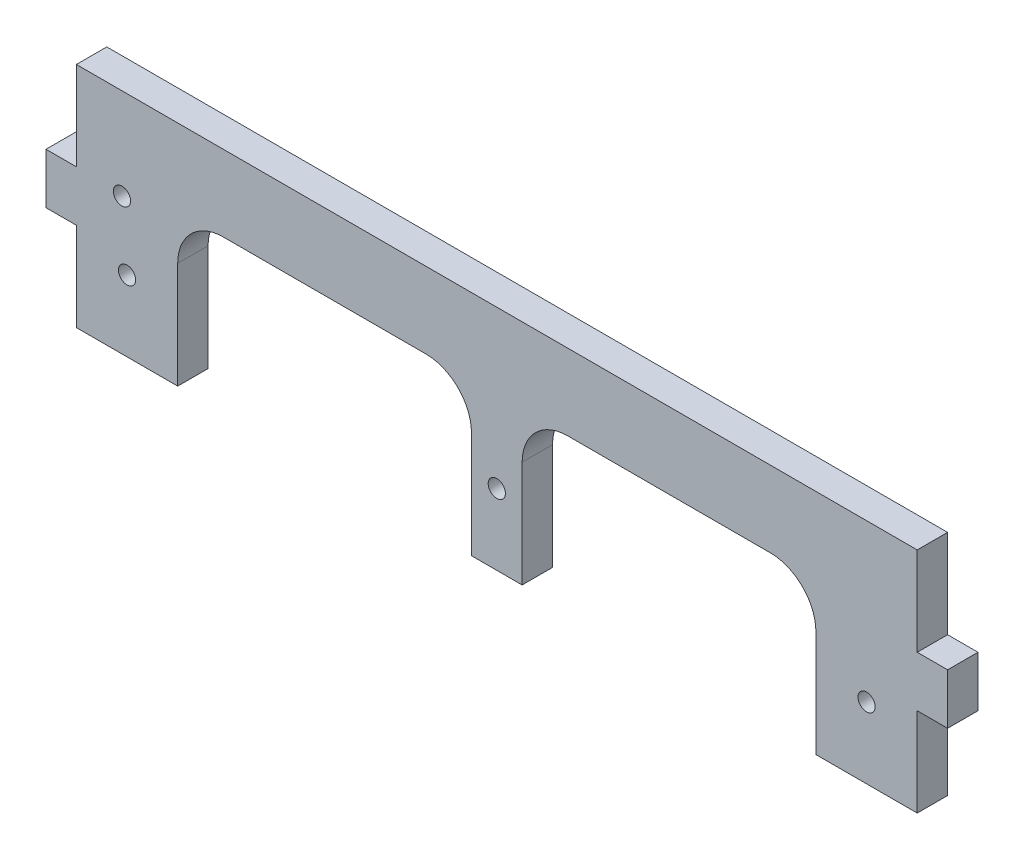
ISO-10303-21;
HEADER;
FILE_DESCRIPTION(('STEP AP214'),'2;1');
FILE_NAME('part.step','',(''),(''),'','','');
FILE_SCHEMA(('AUTOMOTIVE_DESIGN { 1 0 10303 214 1 1 1 1 }'));
ENDSEC;
DATA;
#1=APPLICATION_CONTEXT('core data for automotive mechanical design processes');
#2=APPLICATION_PROTOCOL_DEFINITION('international standard','automotive_design',2000,#1);
#3=PRODUCT_CONTEXT('',#1,'mechanical');
#4=PRODUCT('Part','Part','',(#3));
#5=PRODUCT_RELATED_PRODUCT_CATEGORY('part','',(#4));
#6=PRODUCT_DEFINITION_FORMATION('','',#4);
#7=PRODUCT_DEFINITION_CONTEXT('part definition',#1,'design');
#8=PRODUCT_DEFINITION('design','',#6,#7);
#9=PRODUCT_DEFINITION_SHAPE('','',#8);
#10=(LENGTH_UNIT() NAMED_UNIT(*) SI_UNIT(.MILLI.,.METRE.));
#11=(NAMED_UNIT(*) PLANE_ANGLE_UNIT() SI_UNIT($,.RADIAN.));
#12=(NAMED_UNIT(*) SI_UNIT($,.STERADIAN.) SOLID_ANGLE_UNIT());
#13=UNCERTAINTY_MEASURE_WITH_UNIT(LENGTH_MEASURE(1.E-05),#10,'distance_accuracy_value','');
#14=(GEOMETRIC_REPRESENTATION_CONTEXT(3) GLOBAL_UNCERTAINTY_ASSIGNED_CONTEXT((#13)) GLOBAL_UNIT_ASSIGNED_CONTEXT((#10,
#11,#12)) REPRESENTATION_CONTEXT('',''));
#15=CARTESIAN_POINT('',(0.,0.,0.));
#16=DIRECTION('',(0.,0.,1.));
#17=DIRECTION('',(1.,0.,0.));
#18=AXIS2_PLACEMENT_3D('',#15,#16,#17);
#19=CARTESIAN_POINT('',(20.,0.,6.));
#20=DIRECTION('',(0.,1.,0.));
#21=DIRECTION('',(-1.,0.,0.));
#22=AXIS2_PLACEMENT_3D('',#19,#20,#21);
#23=PLANE('',#22);
#24=DIRECTION('',(1.,0.,0.));
#25=VECTOR('',#24,1.);
#26=CARTESIAN_POINT('',(20.,0.,0.));
#27=LINE('',#26,#25);
#28=CARTESIAN_POINT('',(0.,0.,0.));
#29=VERTEX_POINT('',#28);
#30=CARTESIAN_POINT('',(20.,0.,0.));
#31=VERTEX_POINT('',#30);
#32=EDGE_CURVE('E211',#29,#31,#27,.T.);
#33=ORIENTED_EDGE('',*,*,#32,.T.);
#34=DIRECTION('',(0.,0.,-1.));
#35=VECTOR('',#34,1.);
#36=CARTESIAN_POINT('',(20.,0.,6.));
#37=LINE('',#36,#35);
#38=CARTESIAN_POINT('',(20.,0.,6.));
#39=VERTEX_POINT('',#38);
#40=EDGE_CURVE('E194',#39,#31,#37,.T.);
#41=ORIENTED_EDGE('',*,*,#40,.F.);
#42=DIRECTION('',(1.,0.,0.));
#43=VECTOR('',#42,1.);
#44=CARTESIAN_POINT('',(20.,0.,6.));
#45=LINE('',#44,#43);
#46=CARTESIAN_POINT('',(0.,0.,6.));
#47=VERTEX_POINT('',#46);
#48=EDGE_CURVE('E199',#47,#39,#45,.T.);
#49=ORIENTED_EDGE('',*,*,#48,.F.);
#50=DIRECTION('',(0.,0.,-1.));
#51=VECTOR('',#50,1.);
#52=CARTESIAN_POINT('',(0.,0.,6.));
#53=LINE('',#52,#51);
#54=EDGE_CURVE('E312',#47,#29,#53,.T.);
#55=ORIENTED_EDGE('',*,*,#54,.T.);
#56=EDGE_LOOP('',(#33,#41,#49,#55));
#57=FACE_BOUND('',#56,.T.);
#58=ADVANCED_FACE('F33',(#57),#23,.F.);
#59=CARTESIAN_POINT('',(20.,30.,6.));
#60=DIRECTION('',(-1.,0.,0.));
#61=DIRECTION('',(0.,0.,1.));
#62=AXIS2_PLACEMENT_3D('',#59,#60,#61);
#63=PLANE('',#62);
#64=DIRECTION('',(0.,1.,0.));
#65=VECTOR('',#64,1.);
#66=CARTESIAN_POINT('',(20.,30.,0.));
#67=LINE('',#66,#65);
#68=CARTESIAN_POINT('',(20.,21.,0.));
#69=VERTEX_POINT('',#68);
#70=EDGE_CURVE('E273',#31,#69,#67,.T.);
#71=ORIENTED_EDGE('',*,*,#70,.T.);
#72=DIRECTION('',(0.,0.,-1.));
#73=VECTOR('',#72,1.);
#74=CARTESIAN_POINT('',(20.,21.,6.));
#75=LINE('',#74,#73);
#76=CARTESIAN_POINT('',(20.,21.,6.));
#77=VERTEX_POINT('',#76);
#78=EDGE_CURVE('E48',#69,#77,#75,.F.);
#79=ORIENTED_EDGE('',*,*,#78,.T.);
#80=DIRECTION('',(0.,1.,0.));
#81=VECTOR('',#80,1.);
#82=CARTESIAN_POINT('',(20.,30.,6.));
#83=LINE('',#82,#81);
#84=EDGE_CURVE('E190',#39,#77,#83,.T.);
#85=ORIENTED_EDGE('',*,*,#84,.F.);
#86=ORIENTED_EDGE('',*,*,#40,.T.);
#87=EDGE_LOOP('',(#71,#79,#85,#86));
#88=FACE_BOUND('',#87,.T.);
#89=ADVANCED_FACE('F192',(#88),#63,.F.);
#90=CARTESIAN_POINT('',(78.,30.,6.));
#91=DIRECTION('',(0.,1.,0.));
#92=DIRECTION('',(0.,0.,1.));
#93=AXIS2_PLACEMENT_3D('',#90,#91,#92);
#94=PLANE('',#93);
#95=DIRECTION('',(1.,0.,0.));
#96=VECTOR('',#95,1.);
#97=CARTESIAN_POINT('',(78.,30.,0.));
#98=LINE('',#97,#96);
#99=CARTESIAN_POINT('',(29.,30.,0.));
#100=VERTEX_POINT('',#99);
#101=CARTESIAN_POINT('',(69.,30.,0.));
#102=VERTEX_POINT('',#101);
#103=EDGE_CURVE('E267',#100,#102,#98,.T.);
#104=ORIENTED_EDGE('',*,*,#103,.T.);
#105=DIRECTION('',(0.,0.,-1.));
#106=VECTOR('',#105,1.);
#107=CARTESIAN_POINT('',(69.,30.,6.));
#108=LINE('',#107,#106);
#109=CARTESIAN_POINT('',(69.,30.,6.));
#110=VERTEX_POINT('',#109);
#111=EDGE_CURVE('E235',#102,#110,#108,.F.);
#112=ORIENTED_EDGE('',*,*,#111,.T.);
#113=DIRECTION('',(1.,0.,0.));
#114=VECTOR('',#113,1.);
#115=CARTESIAN_POINT('',(78.,30.,6.));
#116=LINE('',#115,#114);
#117=CARTESIAN_POINT('',(29.,30.,6.));
#118=VERTEX_POINT('',#117);
#119=EDGE_CURVE('E198',#118,#110,#116,.T.);
#120=ORIENTED_EDGE('',*,*,#119,.F.);
#121=DIRECTION('',(0.,0.,-1.));
#122=VECTOR('',#121,1.);
#123=CARTESIAN_POINT('',(29.,30.,0.));
#124=LINE('',#123,#122);
#125=EDGE_CURVE('E232',#118,#100,#124,.T.);
#126=ORIENTED_EDGE('',*,*,#125,.T.);
#127=EDGE_LOOP('',(#104,#112,#120,#126));
#128=FACE_BOUND('',#127,.T.);
#129=ADVANCED_FACE('F271',(#128),#94,.F.);
#130=CARTESIAN_POINT('',(78.,0.,6.));
#131=DIRECTION('',(1.,0.,0.));
#132=DIRECTION('',(0.,1.,0.));
#133=AXIS2_PLACEMENT_3D('',#130,#131,#132);
#134=PLANE('',#133);
#135=DIRECTION('',(0.,-1.,0.));
#136=VECTOR('',#135,1.);
#137=CARTESIAN_POINT('',(78.,0.,6.));
#138=LINE('',#137,#136);
#139=CARTESIAN_POINT('',(78.,21.,6.));
#140=VERTEX_POINT('',#139);
#141=CARTESIAN_POINT('',(78.,0.,6.));
#142=VERTEX_POINT('',#141);
#143=EDGE_CURVE('E252',#140,#142,#138,.T.);
#144=ORIENTED_EDGE('',*,*,#143,.F.);
#145=DIRECTION('',(0.,0.,-1.));
#146=VECTOR('',#145,1.);
#147=CARTESIAN_POINT('',(78.,21.,0.));
#148=LINE('',#147,#146);
#149=CARTESIAN_POINT('',(78.,21.,0.));
#150=VERTEX_POINT('',#149);
#151=EDGE_CURVE('E229',#140,#150,#148,.T.);
#152=ORIENTED_EDGE('',*,*,#151,.T.);
#153=DIRECTION('',(0.,-1.,0.));
#154=VECTOR('',#153,1.);
#155=CARTESIAN_POINT('',(78.,0.,0.));
#156=LINE('',#155,#154);
#157=CARTESIAN_POINT('',(78.,0.,0.));
#158=VERTEX_POINT('',#157);
#159=EDGE_CURVE('E269',#150,#158,#156,.T.);
#160=ORIENTED_EDGE('',*,*,#159,.T.);
#161=DIRECTION('',(0.,0.,-1.));
#162=VECTOR('',#161,1.);
#163=CARTESIAN_POINT('',(78.,0.,6.));
#164=LINE('',#163,#162);
#165=EDGE_CURVE('E213',#142,#158,#164,.T.);
#166=ORIENTED_EDGE('',*,*,#165,.F.);
#167=EDGE_LOOP('',(#144,#152,#160,#166));
#168=FACE_BOUND('',#167,.T.);
#169=ADVANCED_FACE('F259',(#168),#134,.F.);
#170=CARTESIAN_POINT('',(88.,0.,6.));
#171=DIRECTION('',(0.,1.,0.));
#172=DIRECTION('',(-1.,0.,0.));
#173=AXIS2_PLACEMENT_3D('',#170,#171,#172);
#174=PLANE('',#173);
#175=DIRECTION('',(1.,0.,0.));
#176=VECTOR('',#175,1.);
#177=CARTESIAN_POINT('',(88.,0.,0.));
#178=LINE('',#177,#176);
#179=CARTESIAN_POINT('',(88.,0.,0.));
#180=VERTEX_POINT('',#179);
#181=EDGE_CURVE('E275',#158,#180,#178,.T.);
#182=ORIENTED_EDGE('',*,*,#181,.T.);
#183=DIRECTION('',(0.,0.,-1.));
#184=VECTOR('',#183,1.);
#185=CARTESIAN_POINT('',(88.,0.,6.));
#186=LINE('',#185,#184);
#187=CARTESIAN_POINT('',(88.,0.,6.));
#188=VERTEX_POINT('',#187);
#189=EDGE_CURVE('E219',#188,#180,#186,.T.);
#190=ORIENTED_EDGE('',*,*,#189,.F.);
#191=DIRECTION('',(1.,0.,0.));
#192=VECTOR('',#191,1.);
#193=CARTESIAN_POINT('',(88.,0.,6.));
#194=LINE('',#193,#192);
#195=EDGE_CURVE('E262',#142,#188,#194,.T.);
#196=ORIENTED_EDGE('',*,*,#195,.F.);
#197=ORIENTED_EDGE('',*,*,#165,.T.);
#198=EDGE_LOOP('',(#182,#190,#196,#197));
#199=FACE_BOUND('',#198,.T.);
#200=ADVANCED_FACE('F412',(#199),#174,.F.);
#201=CARTESIAN_POINT('',(88.,30.,6.));
#202=DIRECTION('',(-1.,0.,0.));
#203=DIRECTION('',(0.,0.,1.));
#204=AXIS2_PLACEMENT_3D('',#201,#202,#203);
#205=PLANE('',#204);
#206=DIRECTION('',(0.,1.,0.));
#207=VECTOR('',#206,1.);
#208=CARTESIAN_POINT('',(88.,30.,0.));
#209=LINE('',#208,#207);
#210=CARTESIAN_POINT('',(88.,21.,0.));
#211=VERTEX_POINT('',#210);
#212=EDGE_CURVE('E281',#180,#211,#209,.T.);
#213=ORIENTED_EDGE('',*,*,#212,.T.);
#214=DIRECTION('',(0.,0.,-1.));
#215=VECTOR('',#214,1.);
#216=CARTESIAN_POINT('',(88.,21.,6.));
#217=LINE('',#216,#215);
#218=CARTESIAN_POINT('',(88.,21.,6.));
#219=VERTEX_POINT('',#218);
#220=EDGE_CURVE('E227',#211,#219,#217,.F.);
#221=ORIENTED_EDGE('',*,*,#220,.T.);
#222=DIRECTION('',(0.,1.,0.));
#223=VECTOR('',#222,1.);
#224=CARTESIAN_POINT('',(88.,30.,6.));
#225=LINE('',#224,#223);
#226=EDGE_CURVE('E357',#188,#219,#225,.T.);
#227=ORIENTED_EDGE('',*,*,#226,.F.);
#228=ORIENTED_EDGE('',*,*,#189,.T.);
#229=EDGE_LOOP('',(#213,#221,#227,#228));
#230=FACE_BOUND('',#229,.T.);
#231=ADVANCED_FACE('F354',(#230),#205,.F.);
#232=CARTESIAN_POINT('',(146.,30.,6.));
#233=DIRECTION('',(0.,1.,0.));
#234=DIRECTION('',(0.,0.,1.));
#235=AXIS2_PLACEMENT_3D('',#232,#233,#234);
#236=PLANE('',#235);
#237=DIRECTION('',(1.,0.,0.));
#238=VECTOR('',#237,1.);
#239=CARTESIAN_POINT('',(146.,30.,0.));
#240=LINE('',#239,#238);
#241=CARTESIAN_POINT('',(97.,30.,0.));
#242=VERTEX_POINT('',#241);
#243=CARTESIAN_POINT('',(137.,30.,0.));
#244=VERTEX_POINT('',#243);
#245=EDGE_CURVE('E284',#242,#244,#240,.T.);
#246=ORIENTED_EDGE('',*,*,#245,.T.);
#247=DIRECTION('',(0.,0.,-1.));
#248=VECTOR('',#247,1.);
#249=CARTESIAN_POINT('',(137.,30.,6.));
#250=LINE('',#249,#248);
#251=CARTESIAN_POINT('',(137.,30.,6.));
#252=VERTEX_POINT('',#251);
#253=EDGE_CURVE('E225',#244,#252,#250,.F.);
#254=ORIENTED_EDGE('',*,*,#253,.T.);
#255=DIRECTION('',(1.,0.,0.));
#256=VECTOR('',#255,1.);
#257=CARTESIAN_POINT('',(146.,30.,6.));
#258=LINE('',#257,#256);
#259=CARTESIAN_POINT('',(97.,30.,6.));
#260=VERTEX_POINT('',#259);
#261=EDGE_CURVE('E369',#260,#252,#258,.T.);
#262=ORIENTED_EDGE('',*,*,#261,.F.);
#263=DIRECTION('',(0.,0.,-1.));
#264=VECTOR('',#263,1.);
#265=CARTESIAN_POINT('',(97.,30.,0.));
#266=LINE('',#265,#264);
#267=EDGE_CURVE('E216',#260,#242,#266,.T.);
#268=ORIENTED_EDGE('',*,*,#267,.T.);
#269=EDGE_LOOP('',(#246,#254,#262,#268));
#270=FACE_BOUND('',#269,.T.);
#271=ADVANCED_FACE('F366',(#270),#236,.F.);
#272=CARTESIAN_POINT('',(146.,0.,6.));
#273=DIRECTION('',(1.,0.,0.));
#274=DIRECTION('',(0.,0.,-1.));
#275=AXIS2_PLACEMENT_3D('',#272,#273,#274);
#276=PLANE('',#275);
#277=DIRECTION('',(0.,-1.,0.));
#278=VECTOR('',#277,1.);
#279=CARTESIAN_POINT('',(146.,0.,6.));
#280=LINE('',#279,#278);
#281=CARTESIAN_POINT('',(146.,21.,6.));
#282=VERTEX_POINT('',#281);
#283=CARTESIAN_POINT('',(146.,0.,6.));
#284=VERTEX_POINT('',#283);
#285=EDGE_CURVE('E371',#282,#284,#280,.T.);
#286=ORIENTED_EDGE('',*,*,#285,.F.);
#287=DIRECTION('',(0.,0.,-1.));
#288=VECTOR('',#287,1.);
#289=CARTESIAN_POINT('',(146.,21.,0.));
#290=LINE('',#289,#288);
#291=CARTESIAN_POINT('',(146.,21.,0.));
#292=VERTEX_POINT('',#291);
#293=EDGE_CURVE('E212',#282,#292,#290,.T.);
#294=ORIENTED_EDGE('',*,*,#293,.T.);
#295=DIRECTION('',(0.,-1.,0.));
#296=VECTOR('',#295,1.);
#297=CARTESIAN_POINT('',(146.,0.,0.));
#298=LINE('',#297,#296);
#299=CARTESIAN_POINT('',(146.,0.,0.));
#300=VERTEX_POINT('',#299);
#301=EDGE_CURVE('E287',#292,#300,#298,.T.);
#302=ORIENTED_EDGE('',*,*,#301,.T.);
#303=DIRECTION('',(0.,0.,-1.));
#304=VECTOR('',#303,1.);
#305=CARTESIAN_POINT('',(146.,0.,6.));
#306=LINE('',#305,#304);
#307=EDGE_CURVE('E347',#284,#300,#306,.T.);
#308=ORIENTED_EDGE('',*,*,#307,.F.);
#309=EDGE_LOOP('',(#286,#294,#302,#308));
#310=FACE_BOUND('',#309,.T.);
#311=ADVANCED_FACE('F508',(#310),#276,.F.);
#312=CARTESIAN_POINT('',(166.,0.,6.));
#313=DIRECTION('',(0.,1.,0.));
#314=DIRECTION('',(-1.,0.,0.));
#315=AXIS2_PLACEMENT_3D('',#312,#313,#314);
#316=PLANE('',#315);
#317=DIRECTION('',(1.,0.,0.));
#318=VECTOR('',#317,1.);
#319=CARTESIAN_POINT('',(166.,0.,0.));
#320=LINE('',#319,#318);
#321=CARTESIAN_POINT('',(166.,0.,0.));
#322=VERTEX_POINT('',#321);
#323=EDGE_CURVE('E289',#300,#322,#320,.T.);
#324=ORIENTED_EDGE('',*,*,#323,.T.);
#325=DIRECTION('',(0.,0.,-1.));
#326=VECTOR('',#325,1.);
#327=CARTESIAN_POINT('',(166.,0.,6.));
#328=LINE('',#327,#326);
#329=CARTESIAN_POINT('',(166.,0.,6.));
#330=VERTEX_POINT('',#329);
#331=EDGE_CURVE('E344',#330,#322,#328,.T.);
#332=ORIENTED_EDGE('',*,*,#331,.F.);
#333=DIRECTION('',(1.,0.,0.));
#334=VECTOR('',#333,1.);
#335=CARTESIAN_POINT('',(166.,0.,6.));
#336=LINE('',#335,#334);
#337=EDGE_CURVE('E373',#284,#330,#336,.T.);
#338=ORIENTED_EDGE('',*,*,#337,.F.);
#339=ORIENTED_EDGE('',*,*,#307,.T.);
#340=EDGE_LOOP('',(#324,#332,#338,#339));
#341=FACE_BOUND('',#340,.T.);
#342=ADVANCED_FACE('F504',(#341),#316,.F.);
#343=CARTESIAN_POINT('',(166.,17.5,6.));
#344=DIRECTION('',(-1.,0.,0.));
#345=DIRECTION('',(0.,0.,1.));
#346=AXIS2_PLACEMENT_3D('',#343,#344,#345);
#347=PLANE('',#346);
#348=DIRECTION('',(0.,1.,0.));
#349=VECTOR('',#348,1.);
#350=CARTESIAN_POINT('',(166.,17.5,0.));
#351=LINE('',#350,#349);
#352=CARTESIAN_POINT('',(166.,17.5,0.));
#353=VERTEX_POINT('',#352);
#354=EDGE_CURVE('E291',#322,#353,#351,.T.);
#355=ORIENTED_EDGE('',*,*,#354,.T.);
#356=DIRECTION('',(0.,0.,-1.));
#357=VECTOR('',#356,1.);
#358=CARTESIAN_POINT('',(166.,17.5,6.));
#359=LINE('',#358,#357);
#360=CARTESIAN_POINT('',(166.,17.5,6.));
#361=VERTEX_POINT('',#360);
#362=EDGE_CURVE('E341',#361,#353,#359,.T.);
#363=ORIENTED_EDGE('',*,*,#362,.F.);
#364=DIRECTION('',(0.,1.,0.));
#365=VECTOR('',#364,1.);
#366=CARTESIAN_POINT('',(166.,17.5,6.));
#367=LINE('',#366,#365);
#368=EDGE_CURVE('E379',#330,#361,#367,.T.);
#369=ORIENTED_EDGE('',*,*,#368,.F.);
#370=ORIENTED_EDGE('',*,*,#331,.T.);
#371=EDGE_LOOP('',(#355,#363,#369,#370));
#372=FACE_BOUND('',#371,.T.);
#373=ADVANCED_FACE('F500',(#372),#347,.F.);
#374=CARTESIAN_POINT('',(172.,17.5,6.));
#375=DIRECTION('',(0.,1.,0.));
#376=DIRECTION('',(0.,0.,1.));
#377=AXIS2_PLACEMENT_3D('',#374,#375,#376);
#378=PLANE('',#377);
#379=DIRECTION('',(1.,0.,0.));
#380=VECTOR('',#379,1.);
#381=CARTESIAN_POINT('',(172.,17.5,0.));
#382=LINE('',#381,#380);
#383=CARTESIAN_POINT('',(172.,17.5,0.));
#384=VERTEX_POINT('',#383);
#385=EDGE_CURVE('E293',#353,#384,#382,.T.);
#386=ORIENTED_EDGE('',*,*,#385,.T.);
#387=DIRECTION('',(0.,0.,-1.));
#388=VECTOR('',#387,1.);
#389=CARTESIAN_POINT('',(172.,17.5,6.));
#390=LINE('',#389,#388);
#391=CARTESIAN_POINT('',(172.,17.5,6.));
#392=VERTEX_POINT('',#391);
#393=EDGE_CURVE('E338',#392,#384,#390,.T.);
#394=ORIENTED_EDGE('',*,*,#393,.F.);
#395=DIRECTION('',(1.,0.,0.));
#396=VECTOR('',#395,1.);
#397=CARTESIAN_POINT('',(172.,17.5,6.));
#398=LINE('',#397,#396);
#399=EDGE_CURVE('E381',#361,#392,#398,.T.);
#400=ORIENTED_EDGE('',*,*,#399,.F.);
#401=ORIENTED_EDGE('',*,*,#362,.T.);
#402=EDGE_LOOP('',(#386,#394,#400,#401));
#403=FACE_BOUND('',#402,.T.);
#404=ADVANCED_FACE('F496',(#403),#378,.F.);
#405=CARTESIAN_POINT('',(172.,27.5,6.));
#406=DIRECTION('',(-1.,0.,0.));
#407=DIRECTION('',(0.,0.,1.));
#408=AXIS2_PLACEMENT_3D('',#405,#406,#407);
#409=PLANE('',#408);
#410=DIRECTION('',(0.,1.,0.));
#411=VECTOR('',#410,1.);
#412=CARTESIAN_POINT('',(172.,27.5,0.));
#413=LINE('',#412,#411);
#414=CARTESIAN_POINT('',(172.,27.5,0.));
#415=VERTEX_POINT('',#414);
#416=EDGE_CURVE('E295',#384,#415,#413,.T.);
#417=ORIENTED_EDGE('',*,*,#416,.T.);
#418=DIRECTION('',(0.,0.,-1.));
#419=VECTOR('',#418,1.);
#420=CARTESIAN_POINT('',(172.,27.5,6.));
#421=LINE('',#420,#419);
#422=CARTESIAN_POINT('',(172.,27.5,6.));
#423=VERTEX_POINT('',#422);
#424=EDGE_CURVE('E335',#423,#415,#421,.T.);
#425=ORIENTED_EDGE('',*,*,#424,.F.);
#426=DIRECTION('',(0.,1.,0.));
#427=VECTOR('',#426,1.);
#428=CARTESIAN_POINT('',(172.,27.5,6.));
#429=LINE('',#428,#427);
#430=EDGE_CURVE('E383',#392,#423,#429,.T.);
#431=ORIENTED_EDGE('',*,*,#430,.F.);
#432=ORIENTED_EDGE('',*,*,#393,.T.);
#433=EDGE_LOOP('',(#417,#425,#431,#432));
#434=FACE_BOUND('',#433,.T.);
#435=ADVANCED_FACE('F492',(#434),#409,.F.);
#436=CARTESIAN_POINT('',(166.,27.5,6.));
#437=DIRECTION('',(0.,-1.,0.));
#438=DIRECTION('',(0.,0.,-1.));
#439=AXIS2_PLACEMENT_3D('',#436,#437,#438);
#440=PLANE('',#439);
#441=DIRECTION('',(-1.,0.,0.));
#442=VECTOR('',#441,1.);
#443=CARTESIAN_POINT('',(166.,27.5,0.));
#444=LINE('',#443,#442);
#445=CARTESIAN_POINT('',(166.,27.5,0.));
#446=VERTEX_POINT('',#445);
#447=EDGE_CURVE('E297',#415,#446,#444,.T.);
#448=ORIENTED_EDGE('',*,*,#447,.T.);
#449=DIRECTION('',(0.,0.,-1.));
#450=VECTOR('',#449,1.);
#451=CARTESIAN_POINT('',(166.,27.5,6.));
#452=LINE('',#451,#450);
#453=CARTESIAN_POINT('',(166.,27.5,6.));
#454=VERTEX_POINT('',#453);
#455=EDGE_CURVE('E332',#454,#446,#452,.T.);
#456=ORIENTED_EDGE('',*,*,#455,.F.);
#457=DIRECTION('',(-1.,0.,0.));
#458=VECTOR('',#457,1.);
#459=CARTESIAN_POINT('',(166.,27.5,6.));
#460=LINE('',#459,#458);
#461=EDGE_CURVE('E385',#423,#454,#460,.T.);
#462=ORIENTED_EDGE('',*,*,#461,.F.);
#463=ORIENTED_EDGE('',*,*,#424,.T.);
#464=EDGE_LOOP('',(#448,#456,#462,#463));
#465=FACE_BOUND('',#464,.T.);
#466=ADVANCED_FACE('F488',(#465),#440,.F.);
#467=CARTESIAN_POINT('',(166.,45.,6.));
#468=DIRECTION('',(-1.,0.,0.));
#469=DIRECTION('',(0.,0.,1.));
#470=AXIS2_PLACEMENT_3D('',#467,#468,#469);
#471=PLANE('',#470);
#472=DIRECTION('',(0.,1.,0.));
#473=VECTOR('',#472,1.);
#474=CARTESIAN_POINT('',(166.,45.,0.));
#475=LINE('',#474,#473);
#476=CARTESIAN_POINT('',(166.,45.,0.));
#477=VERTEX_POINT('',#476);
#478=EDGE_CURVE('E299',#446,#477,#475,.T.);
#479=ORIENTED_EDGE('',*,*,#478,.T.);
#480=DIRECTION('',(0.,0.,-1.));
#481=VECTOR('',#480,1.);
#482=CARTESIAN_POINT('',(166.,45.,6.));
#483=LINE('',#482,#481);
#484=CARTESIAN_POINT('',(166.,45.,6.));
#485=VERTEX_POINT('',#484);
#486=EDGE_CURVE('E329',#485,#477,#483,.T.);
#487=ORIENTED_EDGE('',*,*,#486,.F.);
#488=DIRECTION('',(0.,1.,0.));
#489=VECTOR('',#488,1.);
#490=CARTESIAN_POINT('',(166.,45.,6.));
#491=LINE('',#490,#489);
#492=EDGE_CURVE('E387',#454,#485,#491,.T.);
#493=ORIENTED_EDGE('',*,*,#492,.F.);
#494=ORIENTED_EDGE('',*,*,#455,.T.);
#495=EDGE_LOOP('',(#479,#487,#493,#494));
#496=FACE_BOUND('',#495,.T.);
#497=ADVANCED_FACE('F484',(#496),#471,.F.);
#498=CARTESIAN_POINT('',(0.,45.,6.));
#499=DIRECTION('',(0.,-1.,0.));
#500=DIRECTION('',(0.,0.,-1.));
#501=AXIS2_PLACEMENT_3D('',#498,#499,#500);
#502=PLANE('',#501);
#503=DIRECTION('',(-1.,0.,0.));
#504=VECTOR('',#503,1.);
#505=CARTESIAN_POINT('',(0.,45.,0.));
#506=LINE('',#505,#504);
#507=CARTESIAN_POINT('',(0.,45.,0.));
#508=VERTEX_POINT('',#507);
#509=EDGE_CURVE('E301',#477,#508,#506,.T.);
#510=ORIENTED_EDGE('',*,*,#509,.T.);
#511=DIRECTION('',(0.,0.,-1.));
#512=VECTOR('',#511,1.);
#513=CARTESIAN_POINT('',(0.,45.,6.));
#514=LINE('',#513,#512);
#515=CARTESIAN_POINT('',(0.,45.,6.));
#516=VERTEX_POINT('',#515);
#517=EDGE_CURVE('E326',#516,#508,#514,.T.);
#518=ORIENTED_EDGE('',*,*,#517,.F.);
#519=DIRECTION('',(-1.,0.,0.));
#520=VECTOR('',#519,1.);
#521=CARTESIAN_POINT('',(0.,45.,6.));
#522=LINE('',#521,#520);
#523=EDGE_CURVE('E389',#485,#516,#522,.T.);
#524=ORIENTED_EDGE('',*,*,#523,.F.);
#525=ORIENTED_EDGE('',*,*,#486,.T.);
#526=EDGE_LOOP('',(#510,#518,#524,#525));
#527=FACE_BOUND('',#526,.T.);
#528=ADVANCED_FACE('F480',(#527),#502,.F.);
#529=CARTESIAN_POINT('',(0.,27.5,6.));
#530=DIRECTION('',(1.,0.,0.));
#531=DIRECTION('',(0.,0.,-1.));
#532=AXIS2_PLACEMENT_3D('',#529,#530,#531);
#533=PLANE('',#532);
#534=DIRECTION('',(0.,-1.,0.));
#535=VECTOR('',#534,1.);
#536=CARTESIAN_POINT('',(0.,27.5,0.));
#537=LINE('',#536,#535);
#538=CARTESIAN_POINT('',(0.,27.5,0.));
#539=VERTEX_POINT('',#538);
#540=EDGE_CURVE('E303',#508,#539,#537,.T.);
#541=ORIENTED_EDGE('',*,*,#540,.T.);
#542=DIRECTION('',(0.,0.,-1.));
#543=VECTOR('',#542,1.);
#544=CARTESIAN_POINT('',(0.,27.5,6.));
#545=LINE('',#544,#543);
#546=CARTESIAN_POINT('',(0.,27.5,6.));
#547=VERTEX_POINT('',#546);
#548=EDGE_CURVE('E323',#547,#539,#545,.T.);
#549=ORIENTED_EDGE('',*,*,#548,.F.);
#550=DIRECTION('',(0.,-1.,0.));
#551=VECTOR('',#550,1.);
#552=CARTESIAN_POINT('',(0.,27.5,6.));
#553=LINE('',#552,#551);
#554=EDGE_CURVE('E391',#516,#547,#553,.T.);
#555=ORIENTED_EDGE('',*,*,#554,.F.);
#556=ORIENTED_EDGE('',*,*,#517,.T.);
#557=EDGE_LOOP('',(#541,#549,#555,#556));
#558=FACE_BOUND('',#557,.T.);
#559=ADVANCED_FACE('F476',(#558),#533,.F.);
#560=CARTESIAN_POINT('',(0.,27.5,6.));
#561=DIRECTION('',(0.,-1.,0.));
#562=DIRECTION('',(1.,0.,0.));
#563=AXIS2_PLACEMENT_3D('',#560,#561,#562);
#564=PLANE('',#563);
#565=DIRECTION('',(-1.,0.,0.));
#566=VECTOR('',#565,1.);
#567=CARTESIAN_POINT('',(0.,27.5,0.));
#568=LINE('',#567,#566);
#569=CARTESIAN_POINT('',(-6.,27.5,0.));
#570=VERTEX_POINT('',#569);
#571=EDGE_CURVE('E305',#539,#570,#568,.T.);
#572=ORIENTED_EDGE('',*,*,#571,.T.);
#573=DIRECTION('',(0.,0.,-1.));
#574=VECTOR('',#573,1.);
#575=CARTESIAN_POINT('',(-6.,27.5,6.));
#576=LINE('',#575,#574);
#577=CARTESIAN_POINT('',(-6.,27.5,6.));
#578=VERTEX_POINT('',#577);
#579=EDGE_CURVE('E320',#578,#570,#576,.T.);
#580=ORIENTED_EDGE('',*,*,#579,.F.);
#581=DIRECTION('',(-1.,0.,0.));
#582=VECTOR('',#581,1.);
#583=CARTESIAN_POINT('',(0.,27.5,6.));
#584=LINE('',#583,#582);
#585=EDGE_CURVE('E393',#547,#578,#584,.T.);
#586=ORIENTED_EDGE('',*,*,#585,.F.);
#587=ORIENTED_EDGE('',*,*,#548,.T.);
#588=EDGE_LOOP('',(#572,#580,#586,#587));
#589=FACE_BOUND('',#588,.T.);
#590=ADVANCED_FACE('F472',(#589),#564,.F.);
#591=CARTESIAN_POINT('',(-6.,27.5,6.));
#592=DIRECTION('',(1.,0.,0.));
#593=DIRECTION('',(0.,0.,-1.));
#594=AXIS2_PLACEMENT_3D('',#591,#592,#593);
#595=PLANE('',#594);
#596=DIRECTION('',(0.,-1.,0.));
#597=VECTOR('',#596,1.);
#598=CARTESIAN_POINT('',(-6.,27.5,0.));
#599=LINE('',#598,#597);
#600=CARTESIAN_POINT('',(-6.,17.5,0.));
#601=VERTEX_POINT('',#600);
#602=EDGE_CURVE('E307',#570,#601,#599,.T.);
#603=ORIENTED_EDGE('',*,*,#602,.T.);
#604=DIRECTION('',(0.,0.,-1.));
#605=VECTOR('',#604,1.);
#606=CARTESIAN_POINT('',(-6.,17.5,6.));
#607=LINE('',#606,#605);
#608=CARTESIAN_POINT('',(-6.,17.5,6.));
#609=VERTEX_POINT('',#608);
#610=EDGE_CURVE('E317',#609,#601,#607,.T.);
#611=ORIENTED_EDGE('',*,*,#610,.F.);
#612=DIRECTION('',(0.,-1.,0.));
#613=VECTOR('',#612,1.);
#614=CARTESIAN_POINT('',(-6.,27.5,6.));
#615=LINE('',#614,#613);
#616=EDGE_CURVE('E395',#578,#609,#615,.T.);
#617=ORIENTED_EDGE('',*,*,#616,.F.);
#618=ORIENTED_EDGE('',*,*,#579,.T.);
#619=EDGE_LOOP('',(#603,#611,#617,#618));
#620=FACE_BOUND('',#619,.T.);
#621=ADVANCED_FACE('F468',(#620),#595,.F.);
#622=CARTESIAN_POINT('',(-6.,17.5,6.));
#623=DIRECTION('',(0.,1.,0.));
#624=DIRECTION('',(0.,0.,1.));
#625=AXIS2_PLACEMENT_3D('',#622,#623,#624);
#626=PLANE('',#625);
#627=DIRECTION('',(1.,0.,0.));
#628=VECTOR('',#627,1.);
#629=CARTESIAN_POINT('',(-6.,17.5,0.));
#630=LINE('',#629,#628);
#631=CARTESIAN_POINT('',(0.,17.5,0.));
#632=VERTEX_POINT('',#631);
#633=EDGE_CURVE('E309',#601,#632,#630,.T.);
#634=ORIENTED_EDGE('',*,*,#633,.T.);
#635=DIRECTION('',(0.,0.,-1.));
#636=VECTOR('',#635,1.);
#637=CARTESIAN_POINT('',(0.,17.5,6.));
#638=LINE('',#637,#636);
#639=CARTESIAN_POINT('',(0.,17.5,6.));
#640=VERTEX_POINT('',#639);
#641=EDGE_CURVE('E314',#640,#632,#638,.T.);
#642=ORIENTED_EDGE('',*,*,#641,.F.);
#643=DIRECTION('',(1.,0.,0.));
#644=VECTOR('',#643,1.);
#645=CARTESIAN_POINT('',(-6.,17.5,6.));
#646=LINE('',#645,#644);
#647=EDGE_CURVE('E397',#609,#640,#646,.T.);
#648=ORIENTED_EDGE('',*,*,#647,.F.);
#649=ORIENTED_EDGE('',*,*,#610,.T.);
#650=EDGE_LOOP('',(#634,#642,#648,#649));
#651=FACE_BOUND('',#650,.T.);
#652=ADVANCED_FACE('F464',(#651),#626,.F.);
#653=CARTESIAN_POINT('',(0.,0.,6.));
#654=DIRECTION('',(1.,0.,0.));
#655=DIRECTION('',(0.,0.,-1.));
#656=AXIS2_PLACEMENT_3D('',#653,#654,#655);
#657=PLANE('',#656);
#658=DIRECTION('',(0.,-1.,0.));
#659=VECTOR('',#658,1.);
#660=CARTESIAN_POINT('',(0.,0.,0.));
#661=LINE('',#660,#659);
#662=EDGE_CURVE('E208',#632,#29,#661,.T.);
#663=ORIENTED_EDGE('',*,*,#662,.T.);
#664=ORIENTED_EDGE('',*,*,#54,.F.);
#665=DIRECTION('',(0.,-1.,0.));
#666=VECTOR('',#665,1.);
#667=CARTESIAN_POINT('',(0.,0.,6.));
#668=LINE('',#667,#666);
#669=EDGE_CURVE('E204',#640,#47,#668,.T.);
#670=ORIENTED_EDGE('',*,*,#669,.F.);
#671=ORIENTED_EDGE('',*,*,#641,.T.);
#672=EDGE_LOOP('',(#663,#664,#670,#671));
#673=FACE_BOUND('',#672,.T.);
#674=ADVANCED_FACE('F457',(#673),#657,.F.);
#675=CARTESIAN_POINT('',(0.,0.,6.));
#676=DIRECTION('',(0.,0.,-1.));
#677=DIRECTION('',(-1.,0.,0.));
#678=AXIS2_PLACEMENT_3D('',#675,#676,#677);
#679=PLANE('',#678);
#680=CARTESIAN_POINT('',(9.00000000000003,27.,6.));
#681=DIRECTION('',(0.,0.,1.));
#682=DIRECTION('',(1.,0.,0.));
#683=AXIS2_PLACEMENT_3D('',#680,#681,#682);
#684=CIRCLE('',#683,1.7);
#685=CARTESIAN_POINT('',(10.7,27.,6.));
#686=VERTEX_POINT('',#685);
#687=EDGE_CURVE('E633',#686,#686,#684,.T.);
#688=ORIENTED_EDGE('',*,*,#687,.F.);
#689=EDGE_LOOP('',(#688));
#690=FACE_BOUND('',#689,.T.);
#691=CARTESIAN_POINT('',(83.,14.,6.));
#692=DIRECTION('',(0.,0.,1.));
#693=DIRECTION('',(1.,0.,0.));
#694=AXIS2_PLACEMENT_3D('',#691,#692,#693);
#695=CIRCLE('',#694,1.70000000000001);
#696=CARTESIAN_POINT('',(84.7,14.,6.));
#697=VERTEX_POINT('',#696);
#698=EDGE_CURVE('E639',#697,#697,#695,.T.);
#699=ORIENTED_EDGE('',*,*,#698,.F.);
#700=EDGE_LOOP('',(#699));
#701=FACE_BOUND('',#700,.T.);
#702=CARTESIAN_POINT('',(156.,14.,6.));
#703=DIRECTION('',(0.,0.,1.));
#704=DIRECTION('',(1.,0.,0.));
#705=AXIS2_PLACEMENT_3D('',#702,#703,#704);
#706=CIRCLE('',#705,1.70000000000001);
#707=CARTESIAN_POINT('',(157.7,14.,6.));
#708=VERTEX_POINT('',#707);
#709=EDGE_CURVE('E409',#708,#708,#706,.T.);
#710=ORIENTED_EDGE('',*,*,#709,.F.);
#711=EDGE_LOOP('',(#710));
#712=FACE_BOUND('',#711,.T.);
#713=CARTESIAN_POINT('',(10.,14.,6.));
#714=DIRECTION('',(0.,0.,1.));
#715=DIRECTION('',(1.,0.,0.));
#716=AXIS2_PLACEMENT_3D('',#713,#714,#715);
#717=CIRCLE('',#716,1.7);
#718=CARTESIAN_POINT('',(11.7,14.,6.));
#719=VERTEX_POINT('',#718);
#720=EDGE_CURVE('E401',#719,#719,#717,.T.);
#721=ORIENTED_EDGE('',*,*,#720,.F.);
#722=EDGE_LOOP('',(#721));
#723=FACE_BOUND('',#722,.T.);
#724=ORIENTED_EDGE('',*,*,#48,.T.);
#725=ORIENTED_EDGE('',*,*,#84,.T.);
#726=CARTESIAN_POINT('',(29.,21.,6.));
#727=DIRECTION('',(0.,0.,-1.));
#728=DIRECTION('',(-1.,0.,0.));
#729=AXIS2_PLACEMENT_3D('',#726,#727,#728);
#730=CIRCLE('',#729,9.);
#731=EDGE_CURVE('E11',#77,#118,#730,.T.);
#732=ORIENTED_EDGE('',*,*,#731,.T.);
#733=ORIENTED_EDGE('',*,*,#119,.T.);
#734=CARTESIAN_POINT('',(69.,21.,6.));
#735=DIRECTION('',(0.,0.,-1.));
#736=DIRECTION('',(-1.,0.,0.));
#737=AXIS2_PLACEMENT_3D('',#734,#735,#736);
#738=CIRCLE('',#737,9.);
#739=EDGE_CURVE('E248',#110,#140,#738,.T.);
#740=ORIENTED_EDGE('',*,*,#739,.T.);
#741=ORIENTED_EDGE('',*,*,#143,.T.);
#742=ORIENTED_EDGE('',*,*,#195,.T.);
#743=ORIENTED_EDGE('',*,*,#226,.T.);
#744=CARTESIAN_POINT('',(97.,21.,6.));
#745=DIRECTION('',(0.,0.,-1.));
#746=DIRECTION('',(-1.,0.,0.));
#747=AXIS2_PLACEMENT_3D('',#744,#745,#746);
#748=CIRCLE('',#747,9.);
#749=EDGE_CURVE('E244',#219,#260,#748,.T.);
#750=ORIENTED_EDGE('',*,*,#749,.T.);
#751=ORIENTED_EDGE('',*,*,#261,.T.);
#752=CARTESIAN_POINT('',(137.,21.,6.));
#753=DIRECTION('',(0.,0.,-1.));
#754=DIRECTION('',(-1.,0.,0.));
#755=AXIS2_PLACEMENT_3D('',#752,#753,#754);
#756=CIRCLE('',#755,9.);
#757=EDGE_CURVE('E240',#252,#282,#756,.T.);
#758=ORIENTED_EDGE('',*,*,#757,.T.);
#759=ORIENTED_EDGE('',*,*,#285,.T.);
#760=ORIENTED_EDGE('',*,*,#337,.T.);
#761=ORIENTED_EDGE('',*,*,#368,.T.);
#762=ORIENTED_EDGE('',*,*,#399,.T.);
#763=ORIENTED_EDGE('',*,*,#430,.T.);
#764=ORIENTED_EDGE('',*,*,#461,.T.);
#765=ORIENTED_EDGE('',*,*,#492,.T.);
#766=ORIENTED_EDGE('',*,*,#523,.T.);
#767=ORIENTED_EDGE('',*,*,#554,.T.);
#768=ORIENTED_EDGE('',*,*,#585,.T.);
#769=ORIENTED_EDGE('',*,*,#616,.T.);
#770=ORIENTED_EDGE('',*,*,#647,.T.);
#771=ORIENTED_EDGE('',*,*,#669,.T.);
#772=EDGE_LOOP('',(#724,#725,#732,#733,#740,#741,#742,#743,#750,#751,#758,#759,#760,#761,#762,
#763,#764,#765,#766,#767,#768,#769,#770,#771));
#773=FACE_BOUND('',#772,.T.);
#774=ADVANCED_FACE('F202',(#690,#701,#712,#723,#773),#679,.F.);
#775=CARTESIAN_POINT('',(0.,0.,0.));
#776=DIRECTION('',(0.,0.,-1.));
#777=DIRECTION('',(-1.,0.,0.));
#778=AXIS2_PLACEMENT_3D('',#775,#776,#777);
#779=PLANE('',#778);
#780=CARTESIAN_POINT('',(9.00000000000003,27.,0.));
#781=DIRECTION('',(0.,0.,1.));
#782=DIRECTION('',(1.,0.,0.));
#783=AXIS2_PLACEMENT_3D('',#780,#781,#782);
#784=CIRCLE('',#783,1.7);
#785=CARTESIAN_POINT('',(10.7,27.,0.));
#786=VERTEX_POINT('',#785);
#787=EDGE_CURVE('E630',#786,#786,#784,.T.);
#788=ORIENTED_EDGE('',*,*,#787,.T.);
#789=EDGE_LOOP('',(#788));
#790=FACE_BOUND('',#789,.T.);
#791=CARTESIAN_POINT('',(83.,14.,0.));
#792=DIRECTION('',(0.,0.,1.));
#793=DIRECTION('',(1.,0.,0.));
#794=AXIS2_PLACEMENT_3D('',#791,#792,#793);
#795=CIRCLE('',#794,1.70000000000001);
#796=CARTESIAN_POINT('',(84.7,14.,0.));
#797=VERTEX_POINT('',#796);
#798=EDGE_CURVE('E406',#797,#797,#795,.T.);
#799=ORIENTED_EDGE('',*,*,#798,.T.);
#800=EDGE_LOOP('',(#799));
#801=FACE_BOUND('',#800,.T.);
#802=CARTESIAN_POINT('',(156.,14.,0.));
#803=DIRECTION('',(0.,0.,1.));
#804=DIRECTION('',(1.,0.,0.));
#805=AXIS2_PLACEMENT_3D('',#802,#803,#804);
#806=CIRCLE('',#805,1.70000000000001);
#807=CARTESIAN_POINT('',(157.7,14.,0.));
#808=VERTEX_POINT('',#807);
#809=EDGE_CURVE('E641',#808,#808,#806,.T.);
#810=ORIENTED_EDGE('',*,*,#809,.T.);
#811=EDGE_LOOP('',(#810));
#812=FACE_BOUND('',#811,.T.);
#813=CARTESIAN_POINT('',(10.,14.,0.));
#814=DIRECTION('',(0.,0.,1.));
#815=DIRECTION('',(1.,0.,0.));
#816=AXIS2_PLACEMENT_3D('',#813,#814,#815);
#817=CIRCLE('',#816,1.7);
#818=CARTESIAN_POINT('',(11.7,14.,0.));
#819=VERTEX_POINT('',#818);
#820=EDGE_CURVE('E399',#819,#819,#817,.T.);
#821=ORIENTED_EDGE('',*,*,#820,.T.);
#822=EDGE_LOOP('',(#821));
#823=FACE_BOUND('',#822,.T.);
#824=ORIENTED_EDGE('',*,*,#32,.F.);
#825=ORIENTED_EDGE('',*,*,#662,.F.);
#826=ORIENTED_EDGE('',*,*,#633,.F.);
#827=ORIENTED_EDGE('',*,*,#602,.F.);
#828=ORIENTED_EDGE('',*,*,#571,.F.);
#829=ORIENTED_EDGE('',*,*,#540,.F.);
#830=ORIENTED_EDGE('',*,*,#509,.F.);
#831=ORIENTED_EDGE('',*,*,#478,.F.);
#832=ORIENTED_EDGE('',*,*,#447,.F.);
#833=ORIENTED_EDGE('',*,*,#416,.F.);
#834=ORIENTED_EDGE('',*,*,#385,.F.);
#835=ORIENTED_EDGE('',*,*,#354,.F.);
#836=ORIENTED_EDGE('',*,*,#323,.F.);
#837=ORIENTED_EDGE('',*,*,#301,.F.);
#838=CARTESIAN_POINT('',(137.,21.,0.));
#839=DIRECTION('',(0.,0.,-1.));
#840=DIRECTION('',(-1.,0.,0.));
#841=AXIS2_PLACEMENT_3D('',#838,#839,#840);
#842=CIRCLE('',#841,9.);
#843=EDGE_CURVE('E238',#292,#244,#842,.F.);
#844=ORIENTED_EDGE('',*,*,#843,.T.);
#845=ORIENTED_EDGE('',*,*,#245,.F.);
#846=CARTESIAN_POINT('',(97.,21.,0.));
#847=DIRECTION('',(0.,0.,-1.));
#848=DIRECTION('',(-1.,0.,0.));
#849=AXIS2_PLACEMENT_3D('',#846,#847,#848);
#850=CIRCLE('',#849,9.);
#851=EDGE_CURVE('E242',#242,#211,#850,.F.);
#852=ORIENTED_EDGE('',*,*,#851,.T.);
#853=ORIENTED_EDGE('',*,*,#212,.F.);
#854=ORIENTED_EDGE('',*,*,#181,.F.);
#855=ORIENTED_EDGE('',*,*,#159,.F.);
#856=CARTESIAN_POINT('',(69.,21.,0.));
#857=DIRECTION('',(0.,0.,-1.));
#858=DIRECTION('',(-1.,0.,0.));
#859=AXIS2_PLACEMENT_3D('',#856,#857,#858);
#860=CIRCLE('',#859,9.);
#861=EDGE_CURVE('E246',#150,#102,#860,.F.);
#862=ORIENTED_EDGE('',*,*,#861,.T.);
#863=ORIENTED_EDGE('',*,*,#103,.F.);
#864=CARTESIAN_POINT('',(29.,21.,0.));
#865=DIRECTION('',(0.,0.,-1.));
#866=DIRECTION('',(-1.,0.,0.));
#867=AXIS2_PLACEMENT_3D('',#864,#865,#866);
#868=CIRCLE('',#867,9.);
#869=EDGE_CURVE('E41',#100,#69,#868,.F.);
#870=ORIENTED_EDGE('',*,*,#869,.T.);
#871=ORIENTED_EDGE('',*,*,#70,.F.);
#872=EDGE_LOOP('',(#824,#825,#826,#827,#828,#829,#830,#831,#832,#833,#834,#835,#836,#837,#844,
#845,#852,#853,#854,#855,#862,#863,#870,#871));
#873=FACE_BOUND('',#872,.T.);
#874=ADVANCED_FACE('F266',(#790,#801,#812,#823,#873),#779,.T.);
#875=CARTESIAN_POINT('',(137.,21.,6.));
#876=DIRECTION('',(0.,0.,1.));
#877=DIRECTION('',(1.,0.,0.));
#878=AXIS2_PLACEMENT_3D('',#875,#876,#877);
#879=CYLINDRICAL_SURFACE('',#878,9.);
#880=ORIENTED_EDGE('',*,*,#757,.F.);
#881=ORIENTED_EDGE('',*,*,#253,.F.);
#882=ORIENTED_EDGE('',*,*,#843,.F.);
#883=ORIENTED_EDGE('',*,*,#293,.F.);
#884=EDGE_LOOP('',(#880,#881,#882,#883));
#885=FACE_BOUND('',#884,.T.);
#886=ADVANCED_FACE('F429',(#885),#879,.F.);
#887=CARTESIAN_POINT('',(97.,21.,6.));
#888=DIRECTION('',(0.,0.,1.));
#889=DIRECTION('',(1.,0.,0.));
#890=AXIS2_PLACEMENT_3D('',#887,#888,#889);
#891=CYLINDRICAL_SURFACE('',#890,9.);
#892=ORIENTED_EDGE('',*,*,#749,.F.);
#893=ORIENTED_EDGE('',*,*,#220,.F.);
#894=ORIENTED_EDGE('',*,*,#851,.F.);
#895=ORIENTED_EDGE('',*,*,#267,.F.);
#896=EDGE_LOOP('',(#892,#893,#894,#895));
#897=FACE_BOUND('',#896,.T.);
#898=ADVANCED_FACE('F363',(#897),#891,.F.);
#899=CARTESIAN_POINT('',(69.,21.,6.));
#900=DIRECTION('',(0.,0.,1.));
#901=DIRECTION('',(1.,0.,0.));
#902=AXIS2_PLACEMENT_3D('',#899,#900,#901);
#903=CYLINDRICAL_SURFACE('',#902,9.);
#904=ORIENTED_EDGE('',*,*,#739,.F.);
#905=ORIENTED_EDGE('',*,*,#111,.F.);
#906=ORIENTED_EDGE('',*,*,#861,.F.);
#907=ORIENTED_EDGE('',*,*,#151,.F.);
#908=EDGE_LOOP('',(#904,#905,#906,#907));
#909=FACE_BOUND('',#908,.T.);
#910=ADVANCED_FACE('F264',(#909),#903,.F.);
#911=CARTESIAN_POINT('',(29.,21.,6.));
#912=DIRECTION('',(0.,0.,1.));
#913=DIRECTION('',(1.,0.,0.));
#914=AXIS2_PLACEMENT_3D('',#911,#912,#913);
#915=CYLINDRICAL_SURFACE('',#914,9.);
#916=ORIENTED_EDGE('',*,*,#731,.F.);
#917=ORIENTED_EDGE('',*,*,#78,.F.);
#918=ORIENTED_EDGE('',*,*,#869,.F.);
#919=ORIENTED_EDGE('',*,*,#125,.F.);
#920=EDGE_LOOP('',(#916,#917,#918,#919));
#921=FACE_BOUND('',#920,.T.);
#922=ADVANCED_FACE('F35',(#921),#915,.F.);
#923=CARTESIAN_POINT('',(10.,14.,0.));
#924=DIRECTION('',(0.,0.,1.));
#925=DIRECTION('',(1.,0.,0.));
#926=AXIS2_PLACEMENT_3D('',#923,#924,#925);
#927=CYLINDRICAL_SURFACE('',#926,1.7);
#928=ORIENTED_EDGE('',*,*,#820,.F.);
#929=EDGE_LOOP('',(#928));
#930=FACE_BOUND('',#929,.T.);
#931=ORIENTED_EDGE('',*,*,#720,.T.);
#932=EDGE_LOOP('',(#931));
#933=FACE_BOUND('',#932,.T.);
#934=ADVANCED_FACE('F438',(#930,#933),#927,.F.);
#935=CARTESIAN_POINT('',(156.,14.,0.));
#936=DIRECTION('',(0.,0.,1.));
#937=DIRECTION('',(1.,0.,0.));
#938=AXIS2_PLACEMENT_3D('',#935,#936,#937);
#939=CYLINDRICAL_SURFACE('',#938,1.70000000000001);
#940=ORIENTED_EDGE('',*,*,#809,.F.);
#941=EDGE_LOOP('',(#940));
#942=FACE_BOUND('',#941,.T.);
#943=ORIENTED_EDGE('',*,*,#709,.T.);
#944=EDGE_LOOP('',(#943));
#945=FACE_BOUND('',#944,.T.);
#946=ADVANCED_FACE('F443',(#942,#945),#939,.F.);
#947=CARTESIAN_POINT('',(83.,14.,0.));
#948=DIRECTION('',(0.,0.,1.));
#949=DIRECTION('',(1.,0.,0.));
#950=AXIS2_PLACEMENT_3D('',#947,#948,#949);
#951=CYLINDRICAL_SURFACE('',#950,1.70000000000001);
#952=ORIENTED_EDGE('',*,*,#798,.F.);
#953=EDGE_LOOP('',(#952));
#954=FACE_BOUND('',#953,.T.);
#955=ORIENTED_EDGE('',*,*,#698,.T.);
#956=EDGE_LOOP('',(#955));
#957=FACE_BOUND('',#956,.T.);
#958=ADVANCED_FACE('F449',(#954,#957),#951,.F.);
#959=CARTESIAN_POINT('',(9.00000000000003,27.,0.));
#960=DIRECTION('',(0.,0.,1.));
#961=DIRECTION('',(1.,0.,0.));
#962=AXIS2_PLACEMENT_3D('',#959,#960,#961);
#963=CYLINDRICAL_SURFACE('',#962,1.7);
#964=ORIENTED_EDGE('',*,*,#787,.F.);
#965=EDGE_LOOP('',(#964));
#966=FACE_BOUND('',#965,.T.);
#967=ORIENTED_EDGE('',*,*,#687,.T.);
#968=EDGE_LOOP('',(#967));
#969=FACE_BOUND('',#968,.T.);
#970=ADVANCED_FACE('F614',(#966,#969),#963,.F.);
#971=CLOSED_SHELL('',(#58,#89,#129,#169,#200,#231,#271,#311,#342,#373,#404,#435,#466,#497,#528,
#559,#590,#621,#652,#674,#774,#874,#886,#898,#910,#922,#934,#946,#958,#970));
#972=MANIFOLD_SOLID_BREP('B2',#971);
#973=ADVANCED_BREP_SHAPE_REPRESENTATION('',(#18,#972),#14);
#974=SHAPE_DEFINITION_REPRESENTATION(#9,#973);
ENDSEC;
END-ISO-10303-21;
